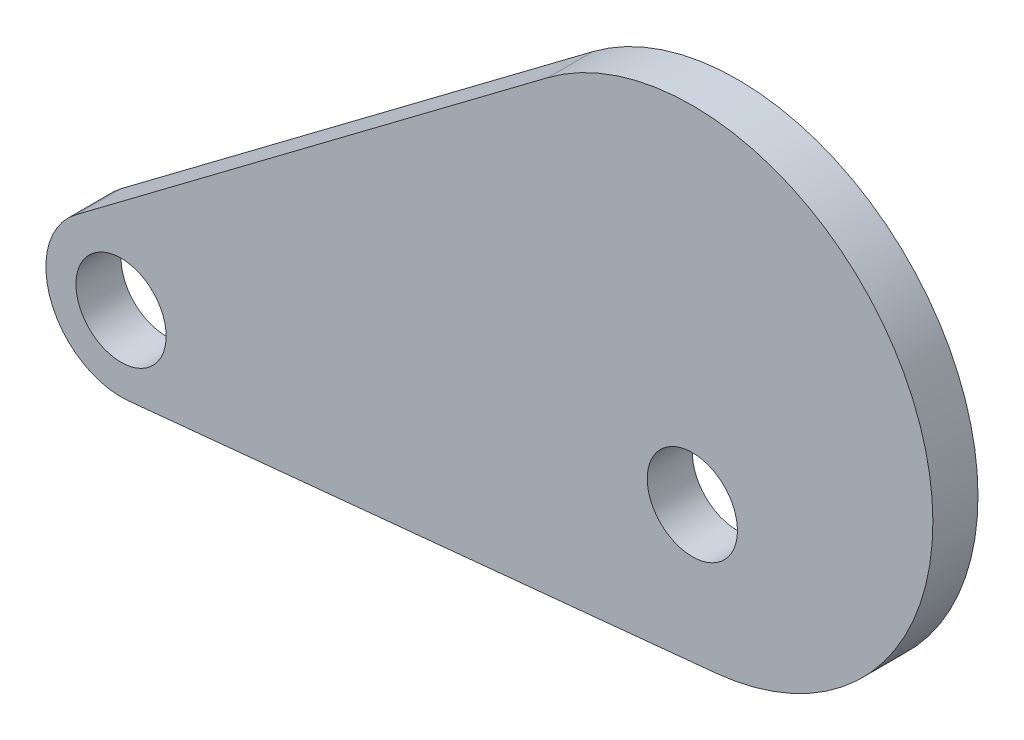
ISO-10303-21;
HEADER;
FILE_DESCRIPTION(('STEP AP214'),'2;1');
FILE_NAME('part.step','',(''),(''),'','','');
FILE_SCHEMA(('AUTOMOTIVE_DESIGN { 1 0 10303 214 1 1 1 1 }'));
ENDSEC;
DATA;
#1=APPLICATION_CONTEXT('core data for automotive mechanical design processes');
#2=APPLICATION_PROTOCOL_DEFINITION('international standard','automotive_design',2000,#1);
#3=PRODUCT_CONTEXT('',#1,'mechanical');
#4=PRODUCT('Part','Part','',(#3));
#5=PRODUCT_RELATED_PRODUCT_CATEGORY('part','',(#4));
#6=PRODUCT_DEFINITION_FORMATION('','',#4);
#7=PRODUCT_DEFINITION_CONTEXT('part definition',#1,'design');
#8=PRODUCT_DEFINITION('design','',#6,#7);
#9=PRODUCT_DEFINITION_SHAPE('','',#8);
#10=(LENGTH_UNIT() NAMED_UNIT(*) SI_UNIT(.MILLI.,.METRE.));
#11=(NAMED_UNIT(*) PLANE_ANGLE_UNIT() SI_UNIT($,.RADIAN.));
#12=(NAMED_UNIT(*) SI_UNIT($,.STERADIAN.) SOLID_ANGLE_UNIT());
#13=UNCERTAINTY_MEASURE_WITH_UNIT(LENGTH_MEASURE(1.E-05),#10,'distance_accuracy_value','');
#14=(GEOMETRIC_REPRESENTATION_CONTEXT(3) GLOBAL_UNCERTAINTY_ASSIGNED_CONTEXT((#13)) GLOBAL_UNIT_ASSIGNED_CONTEXT((#10,
#11,#12)) REPRESENTATION_CONTEXT('',''));
#15=CARTESIAN_POINT('',(0.,0.,0.));
#16=DIRECTION('',(0.,0.,1.));
#17=DIRECTION('',(1.,0.,0.));
#18=AXIS2_PLACEMENT_3D('',#15,#16,#17);
#19=CARTESIAN_POINT('',(19.,10.9,3.));
#20=DIRECTION('',(0.,0.,1.));
#21=DIRECTION('',(1.,0.,0.));
#22=AXIS2_PLACEMENT_3D('',#19,#20,#21);
#23=PLANE('',#22);
#24=CARTESIAN_POINT('',(-19.,-3.9,3.));
#25=DIRECTION('',(0.,0.,1.));
#26=DIRECTION('',(1.,0.,0.));
#27=AXIS2_PLACEMENT_3D('',#24,#25,#26);
#28=CIRCLE('',#27,3.);
#29=CARTESIAN_POINT('',(-16.,-3.9,3.));
#30=VERTEX_POINT('',#29);
#31=EDGE_CURVE('E99',#30,#30,#28,.T.);
#32=ORIENTED_EDGE('',*,*,#31,.F.);
#33=EDGE_LOOP('',(#32));
#34=FACE_BOUND('',#33,.T.);
#35=CARTESIAN_POINT('',(19.,10.9,3.));
#36=DIRECTION('',(0.,0.,1.));
#37=DIRECTION('',(1.,0.,0.));
#38=AXIS2_PLACEMENT_3D('',#35,#36,#37);
#39=CIRCLE('',#38,16.);
#40=CARTESIAN_POINT('',(20.5699297070631,-5.02279249110786,3.));
#41=VERTEX_POINT('',#40);
#42=CARTESIAN_POINT('',(9.386968503443,23.6902160046734,3.));
#43=VERTEX_POINT('',#42);
#44=EDGE_CURVE('E84',#41,#43,#39,.T.);
#45=ORIENTED_EDGE('',*,*,#44,.T.);
#46=DIRECTION('',(-0.799388500292086,-0.600814468534812,0.));
#47=VECTOR('',#46,1.);
#48=CARTESIAN_POINT('',(9.386968503443,23.6902160046734,3.));
#49=LINE('',#48,#47);
#50=CARTESIAN_POINT('',(-22.0040723426739,0.0969425014605806,3.));
#51=VERTEX_POINT('',#50);
#52=EDGE_CURVE('E79',#43,#51,#49,.T.);
#53=ORIENTED_EDGE('',*,*,#52,.T.);
#54=CARTESIAN_POINT('',(-19.,-3.9,3.));
#55=DIRECTION('',(0.,0.,1.));
#56=DIRECTION('',(1.,0.,0.));
#57=AXIS2_PLACEMENT_3D('',#54,#55,#56);
#58=CIRCLE('',#57,5.);
#59=CARTESIAN_POINT('',(-18.5093969665426,-8.87587265347119,3.));
#60=VERTEX_POINT('',#59);
#61=EDGE_CURVE('E82',#51,#60,#58,.T.);
#62=ORIENTED_EDGE('',*,*,#61,.T.);
#63=DIRECTION('',(0.995174530694241,0.0981206066914415,0.));
#64=VECTOR('',#63,1.);
#65=CARTESIAN_POINT('',(-18.5093969665426,-8.87587265347119,3.));
#66=LINE('',#65,#64);
#67=EDGE_CURVE('E49',#60,#41,#66,.T.);
#68=ORIENTED_EDGE('',*,*,#67,.T.);
#69=EDGE_LOOP('',(#45,#53,#62,#68));
#70=FACE_BOUND('',#69,.T.);
#71=CARTESIAN_POINT('',(19.,3.9,3.));
#72=DIRECTION('',(0.,0.,1.));
#73=DIRECTION('',(1.,0.,0.));
#74=AXIS2_PLACEMENT_3D('',#71,#72,#73);
#75=CIRCLE('',#74,3.);
#76=CARTESIAN_POINT('',(22.,3.9,3.));
#77=VERTEX_POINT('',#76);
#78=EDGE_CURVE('E114',#77,#77,#75,.T.);
#79=ORIENTED_EDGE('',*,*,#78,.F.);
#80=EDGE_LOOP('',(#79));
#81=FACE_BOUND('',#80,.T.);
#82=ADVANCED_FACE('F32',(#34,#70,#81),#23,.T.);
#83=CARTESIAN_POINT('',(19.,10.9,0.));
#84=DIRECTION('',(0.,0.,1.));
#85=DIRECTION('',(1.,0.,0.));
#86=AXIS2_PLACEMENT_3D('',#83,#84,#85);
#87=PLANE('',#86);
#88=CARTESIAN_POINT('',(19.,10.9,0.));
#89=DIRECTION('',(0.,0.,1.));
#90=DIRECTION('',(1.,0.,0.));
#91=AXIS2_PLACEMENT_3D('',#88,#89,#90);
#92=CIRCLE('',#91,16.);
#93=CARTESIAN_POINT('',(20.5699297070631,-5.02279249110786,0.));
#94=VERTEX_POINT('',#93);
#95=CARTESIAN_POINT('',(9.386968503443,23.6902160046734,0.));
#96=VERTEX_POINT('',#95);
#97=EDGE_CURVE('E96',#94,#96,#92,.T.);
#98=ORIENTED_EDGE('',*,*,#97,.F.);
#99=DIRECTION('',(0.995174530694241,0.0981206066914415,0.));
#100=VECTOR('',#99,1.);
#101=CARTESIAN_POINT('',(-18.5093969665426,-8.87587265347119,0.));
#102=LINE('',#101,#100);
#103=CARTESIAN_POINT('',(-18.5093969665426,-8.87587265347119,0.));
#104=VERTEX_POINT('',#103);
#105=EDGE_CURVE('E72',#104,#94,#102,.T.);
#106=ORIENTED_EDGE('',*,*,#105,.F.);
#107=CARTESIAN_POINT('',(-19.,-3.9,0.));
#108=DIRECTION('',(0.,0.,1.));
#109=DIRECTION('',(1.,0.,0.));
#110=AXIS2_PLACEMENT_3D('',#107,#108,#109);
#111=CIRCLE('',#110,5.);
#112=CARTESIAN_POINT('',(-22.0040723426739,0.0969425014605806,0.));
#113=VERTEX_POINT('',#112);
#114=EDGE_CURVE('E66',#113,#104,#111,.T.);
#115=ORIENTED_EDGE('',*,*,#114,.F.);
#116=DIRECTION('',(-0.799388500292086,-0.600814468534812,0.));
#117=VECTOR('',#116,1.);
#118=CARTESIAN_POINT('',(9.386968503443,23.6902160046734,0.));
#119=LINE('',#118,#117);
#120=EDGE_CURVE('E88',#96,#113,#119,.T.);
#121=ORIENTED_EDGE('',*,*,#120,.F.);
#122=EDGE_LOOP('',(#98,#106,#115,#121));
#123=FACE_BOUND('',#122,.T.);
#124=CARTESIAN_POINT('',(-19.,-3.9,0.));
#125=DIRECTION('',(0.,0.,1.));
#126=DIRECTION('',(1.,0.,0.));
#127=AXIS2_PLACEMENT_3D('',#124,#125,#126);
#128=CIRCLE('',#127,3.);
#129=CARTESIAN_POINT('',(-16.,-3.9,0.));
#130=VERTEX_POINT('',#129);
#131=EDGE_CURVE('E111',#130,#130,#128,.T.);
#132=ORIENTED_EDGE('',*,*,#131,.T.);
#133=EDGE_LOOP('',(#132));
#134=FACE_BOUND('',#133,.T.);
#135=CARTESIAN_POINT('',(19.,3.9,0.));
#136=DIRECTION('',(0.,0.,1.));
#137=DIRECTION('',(1.,0.,0.));
#138=AXIS2_PLACEMENT_3D('',#135,#136,#137);
#139=CIRCLE('',#138,3.);
#140=CARTESIAN_POINT('',(22.,3.9,0.));
#141=VERTEX_POINT('',#140);
#142=EDGE_CURVE('E117',#141,#141,#139,.T.);
#143=ORIENTED_EDGE('',*,*,#142,.T.);
#144=EDGE_LOOP('',(#143));
#145=FACE_BOUND('',#144,.T.);
#146=ADVANCED_FACE('F107',(#123,#134,#145),#87,.F.);
#147=CARTESIAN_POINT('',(19.,10.9,3.));
#148=DIRECTION('',(0.,0.,-1.));
#149=DIRECTION('',(-1.,0.,0.));
#150=AXIS2_PLACEMENT_3D('',#147,#148,#149);
#151=CYLINDRICAL_SURFACE('',#150,16.);
#152=ORIENTED_EDGE('',*,*,#97,.T.);
#153=DIRECTION('',(0.,0.,-1.));
#154=VECTOR('',#153,1.);
#155=CARTESIAN_POINT('',(9.386968503443,23.6902160046734,3.));
#156=LINE('',#155,#154);
#157=EDGE_CURVE('E11',#43,#96,#156,.T.);
#158=ORIENTED_EDGE('',*,*,#157,.F.);
#159=ORIENTED_EDGE('',*,*,#44,.F.);
#160=DIRECTION('',(0.,0.,-1.));
#161=VECTOR('',#160,1.);
#162=CARTESIAN_POINT('',(20.5699297070631,-5.02279249110786,3.));
#163=LINE('',#162,#161);
#164=EDGE_CURVE('E92',#41,#94,#163,.T.);
#165=ORIENTED_EDGE('',*,*,#164,.T.);
#166=EDGE_LOOP('',(#152,#158,#159,#165));
#167=FACE_BOUND('',#166,.T.);
#168=ADVANCED_FACE('F34',(#167),#151,.T.);
#169=CARTESIAN_POINT('',(9.386968503443,23.6902160046734,3.));
#170=DIRECTION('',(0.600814468534812,-0.799388500292086,0.));
#171=DIRECTION('',(0.799388500292086,0.600814468534812,0.));
#172=AXIS2_PLACEMENT_3D('',#169,#170,#171);
#173=PLANE('',#172);
#174=ORIENTED_EDGE('',*,*,#120,.T.);
#175=DIRECTION('',(0.,0.,-1.));
#176=VECTOR('',#175,1.);
#177=CARTESIAN_POINT('',(-22.0040723426739,0.0969425014605806,3.));
#178=LINE('',#177,#176);
#179=EDGE_CURVE('E41',#51,#113,#178,.T.);
#180=ORIENTED_EDGE('',*,*,#179,.F.);
#181=ORIENTED_EDGE('',*,*,#52,.F.);
#182=ORIENTED_EDGE('',*,*,#157,.T.);
#183=EDGE_LOOP('',(#174,#180,#181,#182));
#184=FACE_BOUND('',#183,.T.);
#185=ADVANCED_FACE('F87',(#184),#173,.F.);
#186=CARTESIAN_POINT('',(-19.,-3.9,3.));
#187=DIRECTION('',(0.,0.,-1.));
#188=DIRECTION('',(-1.,0.,0.));
#189=AXIS2_PLACEMENT_3D('',#186,#187,#188);
#190=CYLINDRICAL_SURFACE('',#189,5.);
#191=ORIENTED_EDGE('',*,*,#114,.T.);
#192=DIRECTION('',(0.,0.,-1.));
#193=VECTOR('',#192,1.);
#194=CARTESIAN_POINT('',(-18.5093969665426,-8.87587265347119,3.));
#195=LINE('',#194,#193);
#196=EDGE_CURVE('E89',#60,#104,#195,.T.);
#197=ORIENTED_EDGE('',*,*,#196,.F.);
#198=ORIENTED_EDGE('',*,*,#61,.F.);
#199=ORIENTED_EDGE('',*,*,#179,.T.);
#200=EDGE_LOOP('',(#191,#197,#198,#199));
#201=FACE_BOUND('',#200,.T.);
#202=ADVANCED_FACE('F90',(#201),#190,.T.);
#203=CARTESIAN_POINT('',(-18.5093969665426,-8.87587265347119,3.));
#204=DIRECTION('',(-0.0981206066914415,0.995174530694241,0.));
#205=DIRECTION('',(-0.995174530694241,-0.0981206066914415,0.));
#206=AXIS2_PLACEMENT_3D('',#203,#204,#205);
#207=PLANE('',#206);
#208=ORIENTED_EDGE('',*,*,#105,.T.);
#209=ORIENTED_EDGE('',*,*,#164,.F.);
#210=ORIENTED_EDGE('',*,*,#67,.F.);
#211=ORIENTED_EDGE('',*,*,#196,.T.);
#212=EDGE_LOOP('',(#208,#209,#210,#211));
#213=FACE_BOUND('',#212,.T.);
#214=ADVANCED_FACE('F104',(#213),#207,.F.);
#215=CARTESIAN_POINT('',(-19.,-3.9,3.));
#216=DIRECTION('',(0.,0.,-1.));
#217=DIRECTION('',(-1.,0.,0.));
#218=AXIS2_PLACEMENT_3D('',#215,#216,#217);
#219=CYLINDRICAL_SURFACE('',#218,3.);
#220=ORIENTED_EDGE('',*,*,#31,.T.);
#221=EDGE_LOOP('',(#220));
#222=FACE_BOUND('',#221,.T.);
#223=ORIENTED_EDGE('',*,*,#131,.F.);
#224=EDGE_LOOP('',(#223));
#225=FACE_BOUND('',#224,.T.);
#226=ADVANCED_FACE('F134',(#222,#225),#219,.F.);
#227=CARTESIAN_POINT('',(19.,3.9,3.));
#228=DIRECTION('',(0.,0.,-1.));
#229=DIRECTION('',(-1.,0.,0.));
#230=AXIS2_PLACEMENT_3D('',#227,#228,#229);
#231=CYLINDRICAL_SURFACE('',#230,3.);
#232=ORIENTED_EDGE('',*,*,#78,.T.);
#233=EDGE_LOOP('',(#232));
#234=FACE_BOUND('',#233,.T.);
#235=ORIENTED_EDGE('',*,*,#142,.F.);
#236=EDGE_LOOP('',(#235));
#237=FACE_BOUND('',#236,.T.);
#238=ADVANCED_FACE('F123',(#234,#237),#231,.F.);
#239=CLOSED_SHELL('',(#82,#146,#168,#185,#202,#214,#226,#238));
#240=MANIFOLD_SOLID_BREP('B2',#239);
#241=ADVANCED_BREP_SHAPE_REPRESENTATION('',(#18,#240),#14);
#242=SHAPE_DEFINITION_REPRESENTATION(#9,#241);
ENDSEC;
END-ISO-10303-21;
